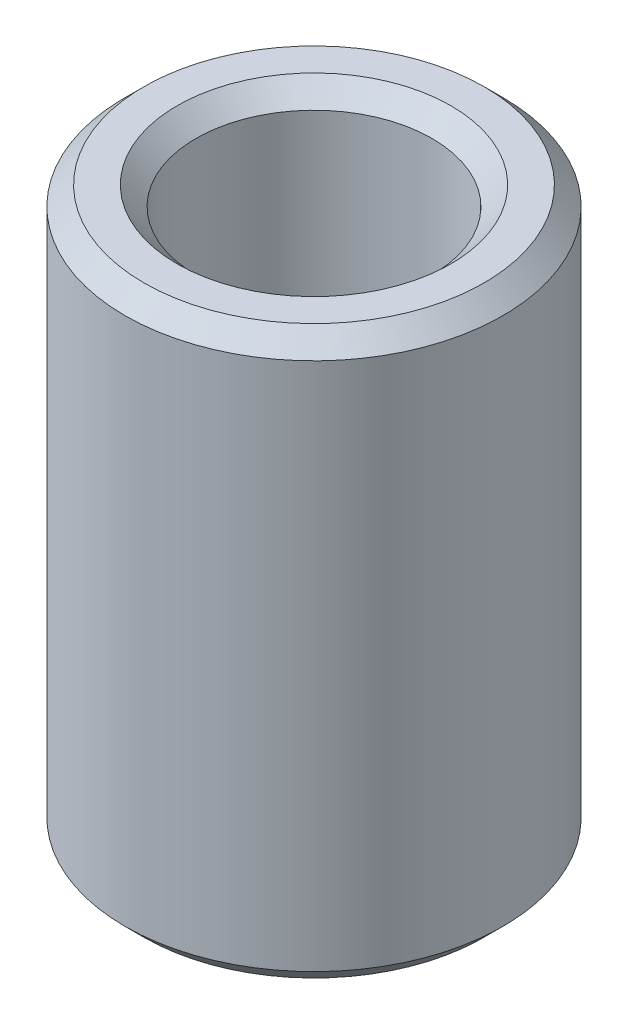
ISO-10303-21;
HEADER;
FILE_DESCRIPTION(('STEP AP214'),'2;1');
FILE_NAME('part.step','',(''),(''),'','','');
FILE_SCHEMA(('AUTOMOTIVE_DESIGN { 1 0 10303 214 1 1 1 1 }'));
ENDSEC;
DATA;
#1=APPLICATION_CONTEXT('core data for automotive mechanical design processes');
#2=APPLICATION_PROTOCOL_DEFINITION('international standard','automotive_design',2000,#1);
#3=PRODUCT_CONTEXT('',#1,'mechanical');
#4=PRODUCT('Part','Part','',(#3));
#5=PRODUCT_RELATED_PRODUCT_CATEGORY('part','',(#4));
#6=PRODUCT_DEFINITION_FORMATION('','',#4);
#7=PRODUCT_DEFINITION_CONTEXT('part definition',#1,'design');
#8=PRODUCT_DEFINITION('design','',#6,#7);
#9=PRODUCT_DEFINITION_SHAPE('','',#8);
#10=(LENGTH_UNIT() NAMED_UNIT(*) SI_UNIT(.MILLI.,.METRE.));
#11=(NAMED_UNIT(*) PLANE_ANGLE_UNIT() SI_UNIT($,.RADIAN.));
#12=(NAMED_UNIT(*) SI_UNIT($,.STERADIAN.) SOLID_ANGLE_UNIT());
#13=UNCERTAINTY_MEASURE_WITH_UNIT(LENGTH_MEASURE(1.E-05),#10,'distance_accuracy_value','');
#14=(GEOMETRIC_REPRESENTATION_CONTEXT(3) GLOBAL_UNCERTAINTY_ASSIGNED_CONTEXT((#13)) GLOBAL_UNIT_ASSIGNED_CONTEXT((#10,
#11,#12)) REPRESENTATION_CONTEXT('',''));
#15=CARTESIAN_POINT('',(0.,0.,0.));
#16=DIRECTION('',(0.,0.,1.));
#17=DIRECTION('',(1.,0.,0.));
#18=AXIS2_PLACEMENT_3D('',#15,#16,#17);
#19=CARTESIAN_POINT('',(0.,60.,0.));
#20=DIRECTION('',(0.,1.,0.));
#21=DIRECTION('',(0.,0.,1.));
#22=AXIS2_PLACEMENT_3D('',#19,#20,#21);
#23=PLANE('',#22);
#24=CARTESIAN_POINT('',(0.,60.,0.));
#25=DIRECTION('',(0.,1.,0.));
#26=DIRECTION('',(0.,0.,1.));
#27=AXIS2_PLACEMENT_3D('',#24,#25,#26);
#28=CIRCLE('',#27,14.5000000000001);
#29=CARTESIAN_POINT('',(0.,60.,14.5000000000001));
#30=VERTEX_POINT('',#29);
#31=EDGE_CURVE('E10',#30,#30,#28,.F.);
#32=ORIENTED_EDGE('',*,*,#31,.T.);
#33=EDGE_LOOP('',(#32));
#34=FACE_BOUND('',#33,.T.);
#35=CARTESIAN_POINT('',(0.,60.,0.));
#36=DIRECTION('',(0.,1.,0.));
#37=DIRECTION('',(0.,0.,1.));
#38=AXIS2_PLACEMENT_3D('',#35,#36,#37);
#39=CIRCLE('',#38,18.);
#40=CARTESIAN_POINT('',(0.,60.,18.));
#41=VERTEX_POINT('',#40);
#42=EDGE_CURVE('E54',#41,#41,#39,.T.);
#43=ORIENTED_EDGE('',*,*,#42,.T.);
#44=EDGE_LOOP('',(#43));
#45=FACE_BOUND('',#44,.T.);
#46=ADVANCED_FACE('F45',(#34,#45),#23,.T.);
#47=CARTESIAN_POINT('',(0.,0.,0.));
#48=DIRECTION('',(0.,1.,0.));
#49=DIRECTION('',(0.,0.,1.));
#50=AXIS2_PLACEMENT_3D('',#47,#48,#49);
#51=PLANE('',#50);
#52=CARTESIAN_POINT('',(0.,0.,0.));
#53=DIRECTION('',(0.,1.,0.));
#54=DIRECTION('',(0.,0.,1.));
#55=AXIS2_PLACEMENT_3D('',#52,#53,#54);
#56=CIRCLE('',#55,14.5);
#57=CARTESIAN_POINT('',(0.,0.,14.5));
#58=VERTEX_POINT('',#57);
#59=EDGE_CURVE('E78',#58,#58,#56,.T.);
#60=ORIENTED_EDGE('',*,*,#59,.T.);
#61=EDGE_LOOP('',(#60));
#62=FACE_BOUND('',#61,.T.);
#63=CARTESIAN_POINT('',(0.,0.,0.));
#64=DIRECTION('',(0.,1.,0.));
#65=DIRECTION('',(0.,0.,1.));
#66=AXIS2_PLACEMENT_3D('',#63,#64,#65);
#67=CIRCLE('',#66,18.);
#68=CARTESIAN_POINT('',(0.,0.,18.));
#69=VERTEX_POINT('',#68);
#70=EDGE_CURVE('E82',#69,#69,#67,.F.);
#71=ORIENTED_EDGE('',*,*,#70,.T.);
#72=EDGE_LOOP('',(#71));
#73=FACE_BOUND('',#72,.T.);
#74=ADVANCED_FACE('F87',(#62,#73),#51,.F.);
#75=CARTESIAN_POINT('',(0.,60.,0.));
#76=DIRECTION('',(0.,-1.,0.));
#77=DIRECTION('',(0.,0.,-1.));
#78=AXIS2_PLACEMENT_3D('',#75,#76,#77);
#79=CYLINDRICAL_SURFACE('',#78,20.);
#80=CARTESIAN_POINT('',(0.,2.00000000000002,0.));
#81=DIRECTION('',(0.,1.,0.));
#82=DIRECTION('',(0.,0.,1.));
#83=AXIS2_PLACEMENT_3D('',#80,#81,#82);
#84=CIRCLE('',#83,20.);
#85=CARTESIAN_POINT('',(0.,2.00000000000002,-20.));
#86=VERTEX_POINT('',#85);
#87=EDGE_CURVE('E59',#86,#86,#84,.T.);
#88=CARTESIAN_POINT('',(0.,58.,0.));
#89=DIRECTION('',(0.,1.,0.));
#90=DIRECTION('',(0.,0.,1.));
#91=AXIS2_PLACEMENT_3D('',#88,#89,#90);
#92=CIRCLE('',#91,20.);
#93=CARTESIAN_POINT('',(0.,58.,-20.));
#94=VERTEX_POINT('',#93);
#95=EDGE_CURVE('E64',#94,#94,#92,.F.);
#96=CARTESIAN_POINT('',(0.,2.00000000000002,-20.));
#97=CARTESIAN_POINT('',(0.,2.58333333333335,-20.));
#98=CARTESIAN_POINT('',(0.,3.16666666666668,-20.));
#99=CARTESIAN_POINT('',(0.,4.33333333333335,-20.));
#100=CARTESIAN_POINT('',(0.,4.91666666666669,-20.));
#101=CARTESIAN_POINT('',(0.,6.08333333333335,-20.));
#102=CARTESIAN_POINT('',(0.,6.66666666666669,-20.));
#103=CARTESIAN_POINT('',(0.,7.83333333333335,-20.));
#104=CARTESIAN_POINT('',(0.,8.41666666666668,-20.));
#105=CARTESIAN_POINT('',(0.,9.58333333333335,-20.));
#106=CARTESIAN_POINT('',(0.,10.1666666666667,-20.));
#107=CARTESIAN_POINT('',(0.,11.3333333333333,-20.));
#108=CARTESIAN_POINT('',(0.,11.9166666666667,-20.));
#109=CARTESIAN_POINT('',(0.,13.0833333333334,-20.));
#110=CARTESIAN_POINT('',(0.,13.6666666666667,-20.));
#111=CARTESIAN_POINT('',(0.,14.8333333333334,-20.));
#112=CARTESIAN_POINT('',(0.,15.4166666666667,-20.));
#113=CARTESIAN_POINT('',(0.,16.5833333333333,-20.));
#114=CARTESIAN_POINT('',(0.,17.1666666666667,-20.));
#115=CARTESIAN_POINT('',(0.,18.3333333333333,-20.));
#116=CARTESIAN_POINT('',(0.,18.9166666666667,-20.));
#117=CARTESIAN_POINT('',(0.,20.0833333333334,-20.));
#118=CARTESIAN_POINT('',(0.,20.6666666666667,-20.));
#119=CARTESIAN_POINT('',(0.,21.8333333333334,-20.));
#120=CARTESIAN_POINT('',(0.,22.4166666666667,-20.));
#121=CARTESIAN_POINT('',(0.,23.5833333333334,-20.));
#122=CARTESIAN_POINT('',(0.,24.1666666666667,-20.));
#123=CARTESIAN_POINT('',(0.,25.3333333333334,-20.));
#124=CARTESIAN_POINT('',(0.,25.9166666666667,-20.));
#125=CARTESIAN_POINT('',(0.,27.0833333333334,-20.));
#126=CARTESIAN_POINT('',(0.,27.6666666666667,-20.));
#127=CARTESIAN_POINT('',(0.,28.8333333333333,-20.));
#128=CARTESIAN_POINT('',(0.,29.4166666666667,-20.));
#129=CARTESIAN_POINT('',(0.,30.5833333333333,-20.));
#130=CARTESIAN_POINT('',(0.,31.1666666666667,-20.));
#131=CARTESIAN_POINT('',(0.,32.3333333333333,-20.));
#132=CARTESIAN_POINT('',(0.,32.9166666666667,-20.));
#133=CARTESIAN_POINT('',(0.,34.0833333333333,-20.));
#134=CARTESIAN_POINT('',(0.,34.6666666666667,-20.));
#135=CARTESIAN_POINT('',(0.,35.8333333333333,-20.));
#136=CARTESIAN_POINT('',(0.,36.4166666666667,-20.));
#137=CARTESIAN_POINT('',(0.,37.5833333333333,-20.));
#138=CARTESIAN_POINT('',(0.,38.1666666666667,-20.));
#139=CARTESIAN_POINT('',(0.,39.3333333333333,-20.));
#140=CARTESIAN_POINT('',(0.,39.9166666666667,-20.));
#141=CARTESIAN_POINT('',(0.,41.0833333333334,-20.));
#142=CARTESIAN_POINT('',(0.,41.6666666666667,-20.));
#143=CARTESIAN_POINT('',(0.,42.8333333333334,-20.));
#144=CARTESIAN_POINT('',(0.,43.4166666666667,-20.));
#145=CARTESIAN_POINT('',(0.,44.5833333333334,-20.));
#146=CARTESIAN_POINT('',(0.,45.1666666666667,-20.));
#147=CARTESIAN_POINT('',(0.,46.3333333333333,-20.));
#148=CARTESIAN_POINT('',(0.,46.9166666666667,-20.));
#149=CARTESIAN_POINT('',(0.,48.0833333333333,-20.));
#150=CARTESIAN_POINT('',(0.,48.6666666666667,-20.));
#151=CARTESIAN_POINT('',(0.,49.8333333333333,-20.));
#152=CARTESIAN_POINT('',(0.,50.4166666666667,-20.));
#153=CARTESIAN_POINT('',(0.,51.5833333333333,-20.));
#154=CARTESIAN_POINT('',(0.,52.1666666666667,-20.));
#155=CARTESIAN_POINT('',(0.,53.3333333333333,-20.));
#156=CARTESIAN_POINT('',(0.,53.9166666666667,-20.));
#157=CARTESIAN_POINT('',(0.,55.0833333333333,-20.));
#158=CARTESIAN_POINT('',(0.,55.6666666666667,-20.));
#159=CARTESIAN_POINT('',(0.,56.8333333333333,-20.));
#160=CARTESIAN_POINT('',(0.,57.4166666666667,-20.));
#161=CARTESIAN_POINT('',(0.,58.,-20.));
#162=B_SPLINE_CURVE_WITH_KNOTS('',3,(#96,#97,#98,#99,#100,#101,#102,#103,#104,#105,#106,#107,
#108,#109,#110,#111,#112,#113,#114,#115,#116,#117,#118,#119,#120,#121,#122,#123,#124,#125,#126,
#127,#128,#129,#130,#131,#132,#133,#134,#135,#136,#137,#138,#139,#140,#141,#142,#143,#144,#145,
#146,#147,#148,#149,#150,#151,#152,#153,#154,#155,#156,#157,#158,#159,#160,#161),.UNSPECIFIED.,
.F.,.F.,(4,2,2,2,2,2,2,2,2,2,2,2,2,2,2,2,2,2,2,2,2,2,2,2,2,2,2,2,2,2,2,2,4),(0.,1.75,3.5,5.25,
7.,8.75,10.5,12.25,14.,15.75,17.5,19.25,21.,22.75,24.5,26.25,28.,29.75,31.5,33.25,35.,36.75,
38.5,40.25,42.,43.75,45.5,47.25,49.,50.75,52.5,54.25,56.),.UNSPECIFIED.);
#163=EDGE_CURVE('BSEAM97',#86,#94,#162,.T.);
#164=ORIENTED_EDGE('',*,*,#87,.T.);
#165=ORIENTED_EDGE('',*,*,#95,.T.);
#166=ORIENTED_EDGE('',*,*,#163,.T.);
#167=ORIENTED_EDGE('',*,*,#163,.F.);
#168=EDGE_LOOP('',(#164,#166,#165,#167));
#169=FACE_BOUND('',#168,.T.);
#170=ADVANCED_FACE('F97',(#169),#79,.T.);
#171=CARTESIAN_POINT('',(0.,60.,0.));
#172=DIRECTION('',(0.,-1.,0.));
#173=DIRECTION('',(0.,0.,-1.));
#174=AXIS2_PLACEMENT_3D('',#171,#172,#173);
#175=CYLINDRICAL_SURFACE('',#174,12.5);
#176=CARTESIAN_POINT('',(0.,2.,0.));
#177=DIRECTION('',(0.,1.,0.));
#178=DIRECTION('',(0.,0.,1.));
#179=AXIS2_PLACEMENT_3D('',#176,#177,#178);
#180=CIRCLE('',#179,12.5);
#181=CARTESIAN_POINT('',(0.,2.,-12.5));
#182=VERTEX_POINT('',#181);
#183=EDGE_CURVE('E70',#182,#182,#180,.F.);
#184=CARTESIAN_POINT('',(0.,58.,0.));
#185=DIRECTION('',(0.,1.,0.));
#186=DIRECTION('',(0.,0.,1.));
#187=AXIS2_PLACEMENT_3D('',#184,#185,#186);
#188=CIRCLE('',#187,12.5);
#189=CARTESIAN_POINT('',(0.,58.,-12.5));
#190=VERTEX_POINT('',#189);
#191=EDGE_CURVE('E74',#190,#190,#188,.T.);
#192=CARTESIAN_POINT('',(0.,2.,-12.5));
#193=CARTESIAN_POINT('',(0.,2.58333333333334,-12.5));
#194=CARTESIAN_POINT('',(0.,3.16666666666667,-12.5));
#195=CARTESIAN_POINT('',(0.,4.33333333333333,-12.5));
#196=CARTESIAN_POINT('',(0.,4.91666666666667,-12.5));
#197=CARTESIAN_POINT('',(0.,6.08333333333333,-12.5));
#198=CARTESIAN_POINT('',(0.,6.66666666666667,-12.5));
#199=CARTESIAN_POINT('',(0.,7.83333333333333,-12.5));
#200=CARTESIAN_POINT('',(0.,8.41666666666666,-12.5));
#201=CARTESIAN_POINT('',(0.,9.58333333333333,-12.5));
#202=CARTESIAN_POINT('',(0.,10.1666666666667,-12.5));
#203=CARTESIAN_POINT('',(0.,11.3333333333333,-12.5));
#204=CARTESIAN_POINT('',(0.,11.9166666666667,-12.5));
#205=CARTESIAN_POINT('',(0.,13.0833333333333,-12.5));
#206=CARTESIAN_POINT('',(0.,13.6666666666667,-12.5));
#207=CARTESIAN_POINT('',(0.,14.8333333333333,-12.5));
#208=CARTESIAN_POINT('',(0.,15.4166666666667,-12.5));
#209=CARTESIAN_POINT('',(0.,16.5833333333333,-12.5));
#210=CARTESIAN_POINT('',(0.,17.1666666666667,-12.5));
#211=CARTESIAN_POINT('',(0.,18.3333333333333,-12.5));
#212=CARTESIAN_POINT('',(0.,18.9166666666667,-12.5));
#213=CARTESIAN_POINT('',(0.,20.0833333333333,-12.5));
#214=CARTESIAN_POINT('',(0.,20.6666666666667,-12.5));
#215=CARTESIAN_POINT('',(0.,21.8333333333333,-12.5));
#216=CARTESIAN_POINT('',(0.,22.4166666666667,-12.5));
#217=CARTESIAN_POINT('',(0.,23.5833333333333,-12.5));
#218=CARTESIAN_POINT('',(0.,24.1666666666667,-12.5));
#219=CARTESIAN_POINT('',(0.,25.3333333333333,-12.5));
#220=CARTESIAN_POINT('',(0.,25.9166666666666,-12.5));
#221=CARTESIAN_POINT('',(0.,27.0833333333333,-12.5));
#222=CARTESIAN_POINT('',(0.,27.6666666666667,-12.5));
#223=CARTESIAN_POINT('',(0.,28.8333333333333,-12.5));
#224=CARTESIAN_POINT('',(0.,29.4166666666666,-12.5));
#225=CARTESIAN_POINT('',(0.,30.5833333333333,-12.5));
#226=CARTESIAN_POINT('',(0.,31.1666666666666,-12.5));
#227=CARTESIAN_POINT('',(0.,32.3333333333333,-12.5));
#228=CARTESIAN_POINT('',(0.,32.9166666666666,-12.5));
#229=CARTESIAN_POINT('',(0.,34.0833333333333,-12.5));
#230=CARTESIAN_POINT('',(0.,34.6666666666666,-12.5));
#231=CARTESIAN_POINT('',(0.,35.8333333333333,-12.5));
#232=CARTESIAN_POINT('',(0.,36.4166666666666,-12.5));
#233=CARTESIAN_POINT('',(0.,37.5833333333333,-12.5));
#234=CARTESIAN_POINT('',(0.,38.1666666666666,-12.5));
#235=CARTESIAN_POINT('',(0.,39.3333333333333,-12.5));
#236=CARTESIAN_POINT('',(0.,39.9166666666666,-12.5));
#237=CARTESIAN_POINT('',(0.,41.0833333333333,-12.5));
#238=CARTESIAN_POINT('',(0.,41.6666666666666,-12.5));
#239=CARTESIAN_POINT('',(0.,42.8333333333333,-12.5));
#240=CARTESIAN_POINT('',(0.,43.4166666666666,-12.5));
#241=CARTESIAN_POINT('',(0.,44.5833333333333,-12.5));
#242=CARTESIAN_POINT('',(0.,45.1666666666666,-12.5));
#243=CARTESIAN_POINT('',(0.,46.3333333333333,-12.5));
#244=CARTESIAN_POINT('',(0.,46.9166666666666,-12.5));
#245=CARTESIAN_POINT('',(0.,48.0833333333333,-12.5));
#246=CARTESIAN_POINT('',(0.,48.6666666666666,-12.5));
#247=CARTESIAN_POINT('',(0.,49.8333333333333,-12.5));
#248=CARTESIAN_POINT('',(0.,50.4166666666666,-12.5));
#249=CARTESIAN_POINT('',(0.,51.5833333333333,-12.5));
#250=CARTESIAN_POINT('',(0.,52.1666666666666,-12.5));
#251=CARTESIAN_POINT('',(0.,53.3333333333333,-12.5));
#252=CARTESIAN_POINT('',(0.,53.9166666666666,-12.5));
#253=CARTESIAN_POINT('',(0.,55.0833333333333,-12.5));
#254=CARTESIAN_POINT('',(0.,55.6666666666666,-12.5));
#255=CARTESIAN_POINT('',(0.,56.8333333333333,-12.5));
#256=CARTESIAN_POINT('',(0.,57.4166666666666,-12.5));
#257=CARTESIAN_POINT('',(0.,58.,-12.5));
#258=B_SPLINE_CURVE_WITH_KNOTS('',3,(#192,#193,#194,#195,#196,#197,#198,#199,#200,#201,#202,
#203,#204,#205,#206,#207,#208,#209,#210,#211,#212,#213,#214,#215,#216,#217,#218,#219,#220,#221,
#222,#223,#224,#225,#226,#227,#228,#229,#230,#231,#232,#233,#234,#235,#236,#237,#238,#239,#240,
#241,#242,#243,#244,#245,#246,#247,#248,#249,#250,#251,#252,#253,#254,#255,#256,#257),
.UNSPECIFIED.,.F.,.F.,(4,2,2,2,2,2,2,2,2,2,2,2,2,2,2,2,2,2,2,2,2,2,2,2,2,2,2,2,2,2,2,2,4),(0.,
1.75,3.5,5.25,6.99999999999999,8.74999999999999,10.5,12.25,14.,15.75,17.5,19.25,21.,22.75,24.5,
26.25,28.,29.75,31.5,33.25,35.,36.75,38.5,40.25,42.,43.75,45.5,47.25,49.,50.75,52.5,
54.2499999999999,55.9999999999999),.UNSPECIFIED.);
#259=EDGE_CURVE('BSEAM100',#182,#190,#258,.T.);
#260=ORIENTED_EDGE('',*,*,#183,.T.);
#261=ORIENTED_EDGE('',*,*,#191,.T.);
#262=ORIENTED_EDGE('',*,*,#259,.T.);
#263=ORIENTED_EDGE('',*,*,#259,.F.);
#264=EDGE_LOOP('',(#260,#262,#261,#263));
#265=FACE_BOUND('',#264,.T.);
#266=ADVANCED_FACE('F100',(#265),#175,.F.);
#267=CARTESIAN_POINT('',(0.,0.,0.));
#268=DIRECTION('',(0.,-1.,0.));
#269=DIRECTION('',(0.,0.,-1.));
#270=AXIS2_PLACEMENT_3D('',#267,#268,#269);
#271=CONICAL_SURFACE('',#270,14.5,0.785398163397444);
#272=ORIENTED_EDGE('',*,*,#183,.F.);
#273=EDGE_LOOP('',(#272));
#274=FACE_BOUND('',#273,.T.);
#275=ORIENTED_EDGE('',*,*,#59,.F.);
#276=EDGE_LOOP('',(#275));
#277=FACE_BOUND('',#276,.T.);
#278=ADVANCED_FACE('F93',(#274,#277),#271,.F.);
#279=CARTESIAN_POINT('',(0.,2.00000000000002,0.));
#280=DIRECTION('',(0.,1.,0.));
#281=DIRECTION('',(0.,0.,1.));
#282=AXIS2_PLACEMENT_3D('',#279,#280,#281);
#283=CONICAL_SURFACE('',#282,20.,0.78539816339745);
#284=ORIENTED_EDGE('',*,*,#70,.F.);
#285=EDGE_LOOP('',(#284));
#286=FACE_BOUND('',#285,.T.);
#287=ORIENTED_EDGE('',*,*,#87,.F.);
#288=EDGE_LOOP('',(#287));
#289=FACE_BOUND('',#288,.T.);
#290=ADVANCED_FACE('F89',(#286,#289),#283,.T.);
#291=CARTESIAN_POINT('',(0.,58.,0.));
#292=DIRECTION('',(0.,1.,0.));
#293=DIRECTION('',(0.,0.,1.));
#294=AXIS2_PLACEMENT_3D('',#291,#292,#293);
#295=CONICAL_SURFACE('',#294,12.5,0.785398163397449);
#296=ORIENTED_EDGE('',*,*,#31,.F.);
#297=EDGE_LOOP('',(#296));
#298=FACE_BOUND('',#297,.T.);
#299=ORIENTED_EDGE('',*,*,#191,.F.);
#300=EDGE_LOOP('',(#299));
#301=FACE_BOUND('',#300,.T.);
#302=ADVANCED_FACE('F92',(#298,#301),#295,.F.);
#303=CARTESIAN_POINT('',(0.,60.,0.));
#304=DIRECTION('',(0.,-1.,0.));
#305=DIRECTION('',(0.,0.,-1.));
#306=AXIS2_PLACEMENT_3D('',#303,#304,#305);
#307=CONICAL_SURFACE('',#306,18.,0.785398163397443);
#308=ORIENTED_EDGE('',*,*,#95,.F.);
#309=EDGE_LOOP('',(#308));
#310=FACE_BOUND('',#309,.T.);
#311=ORIENTED_EDGE('',*,*,#42,.F.);
#312=EDGE_LOOP('',(#311));
#313=FACE_BOUND('',#312,.T.);
#314=ADVANCED_FACE('F48',(#310,#313),#307,.T.);
#315=CLOSED_SHELL('',(#46,#74,#170,#266,#278,#290,#302,#314));
#316=MANIFOLD_SOLID_BREP('B2',#315);
#317=ADVANCED_BREP_SHAPE_REPRESENTATION('',(#18,#316),#14);
#318=SHAPE_DEFINITION_REPRESENTATION(#9,#317);
ENDSEC;
END-ISO-10303-21;
